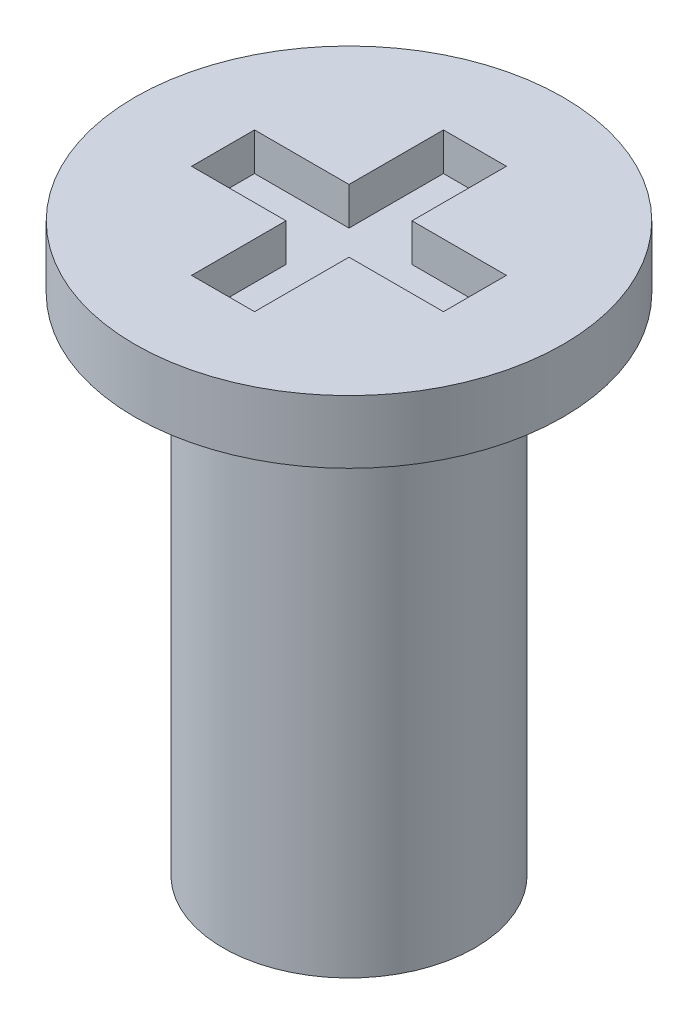
ISO-10303-21;
HEADER;
FILE_DESCRIPTION(('STEP AP214'),'2;1');
FILE_NAME('part.step','',(''),(''),'','','');
FILE_SCHEMA(('AUTOMOTIVE_DESIGN { 1 0 10303 214 1 1 1 1 }'));
ENDSEC;
DATA;
#1=APPLICATION_CONTEXT('core data for automotive mechanical design processes');
#2=APPLICATION_PROTOCOL_DEFINITION('international standard','automotive_design',2000,#1);
#3=PRODUCT_CONTEXT('',#1,'mechanical');
#4=PRODUCT('Part','Part','',(#3));
#5=PRODUCT_RELATED_PRODUCT_CATEGORY('part','',(#4));
#6=PRODUCT_DEFINITION_FORMATION('','',#4);
#7=PRODUCT_DEFINITION_CONTEXT('part definition',#1,'design');
#8=PRODUCT_DEFINITION('design','',#6,#7);
#9=PRODUCT_DEFINITION_SHAPE('','',#8);
#10=(LENGTH_UNIT() NAMED_UNIT(*) SI_UNIT(.MILLI.,.METRE.));
#11=(NAMED_UNIT(*) PLANE_ANGLE_UNIT() SI_UNIT($,.RADIAN.));
#12=(NAMED_UNIT(*) SI_UNIT($,.STERADIAN.) SOLID_ANGLE_UNIT());
#13=UNCERTAINTY_MEASURE_WITH_UNIT(LENGTH_MEASURE(1.E-05),#10,'distance_accuracy_value','');
#14=(GEOMETRIC_REPRESENTATION_CONTEXT(3) GLOBAL_UNCERTAINTY_ASSIGNED_CONTEXT((#13)) GLOBAL_UNIT_ASSIGNED_CONTEXT((#10,
#11,#12)) REPRESENTATION_CONTEXT('',''));
#15=CARTESIAN_POINT('',(0.,0.,0.));
#16=DIRECTION('',(0.,0.,1.));
#17=DIRECTION('',(1.,0.,0.));
#18=AXIS2_PLACEMENT_3D('',#15,#16,#17);
#19=CARTESIAN_POINT('',(0.,0.,0.));
#20=DIRECTION('',(0.,1.,0.));
#21=DIRECTION('',(-1.,0.,0.));
#22=AXIS2_PLACEMENT_3D('',#19,#20,#21);
#23=PLANE('',#22);
#24=DIRECTION('',(-1.,0.,0.));
#25=VECTOR('',#24,1.);
#26=CARTESIAN_POINT('',(0.,0.,-0.25));
#27=LINE('',#26,#25);
#28=CARTESIAN_POINT('',(1.,0.,-0.249999999999997));
#29=VERTEX_POINT('',#28);
#30=CARTESIAN_POINT('',(0.25,0.,-0.249999999999999));
#31=VERTEX_POINT('',#30);
#32=EDGE_CURVE('E196',#29,#31,#27,.T.);
#33=ORIENTED_EDGE('',*,*,#32,.F.);
#34=DIRECTION('',(0.,0.,-1.));
#35=VECTOR('',#34,1.);
#36=CARTESIAN_POINT('',(1.,0.,-0.249999999999997));
#37=LINE('',#36,#35);
#38=CARTESIAN_POINT('',(0.999999999999999,0.,0.250000000000003));
#39=VERTEX_POINT('',#38);
#40=EDGE_CURVE('E142',#39,#29,#37,.T.);
#41=ORIENTED_EDGE('',*,*,#40,.F.);
#42=DIRECTION('',(1.,0.,0.));
#43=VECTOR('',#42,1.);
#44=CARTESIAN_POINT('',(0.,0.,0.25));
#45=LINE('',#44,#43);
#46=CARTESIAN_POINT('',(0.25,0.,0.250000000000003));
#47=VERTEX_POINT('',#46);
#48=EDGE_CURVE('E198',#47,#39,#45,.T.);
#49=ORIENTED_EDGE('',*,*,#48,.F.);
#50=DIRECTION('',(0.,0.,-1.));
#51=VECTOR('',#50,1.);
#52=CARTESIAN_POINT('',(0.25,0.,0.));
#53=LINE('',#52,#51);
#54=CARTESIAN_POINT('',(0.25,0.,1.));
#55=VERTEX_POINT('',#54);
#56=EDGE_CURVE('E168',#55,#47,#53,.T.);
#57=ORIENTED_EDGE('',*,*,#56,.F.);
#58=DIRECTION('',(1.,0.,0.));
#59=VECTOR('',#58,1.);
#60=CARTESIAN_POINT('',(0.25,0.,1.));
#61=LINE('',#60,#59);
#62=CARTESIAN_POINT('',(-0.25,0.,1.));
#63=VERTEX_POINT('',#62);
#64=EDGE_CURVE('E172',#63,#55,#61,.T.);
#65=ORIENTED_EDGE('',*,*,#64,.F.);
#66=DIRECTION('',(0.,0.,1.));
#67=VECTOR('',#66,1.);
#68=CARTESIAN_POINT('',(-0.25,0.,0.));
#69=LINE('',#68,#67);
#70=CARTESIAN_POINT('',(-0.25,0.,0.249999999999998));
#71=VERTEX_POINT('',#70);
#72=EDGE_CURVE('E180',#71,#63,#69,.T.);
#73=ORIENTED_EDGE('',*,*,#72,.F.);
#74=DIRECTION('',(1.,0.,0.));
#75=VECTOR('',#74,1.);
#76=CARTESIAN_POINT('',(0.,0.,0.25));
#77=LINE('',#76,#75);
#78=CARTESIAN_POINT('',(-1.,0.,0.24999999999999));
#79=VERTEX_POINT('',#78);
#80=EDGE_CURVE('E161',#79,#71,#77,.T.);
#81=ORIENTED_EDGE('',*,*,#80,.F.);
#82=DIRECTION('',(0.,0.,1.));
#83=VECTOR('',#82,1.);
#84=CARTESIAN_POINT('',(-1.,0.,0.24999999999999));
#85=LINE('',#84,#83);
#86=CARTESIAN_POINT('',(-0.999999999999997,0.,-0.25000000000001));
#87=VERTEX_POINT('',#86);
#88=EDGE_CURVE('E158',#87,#79,#85,.T.);
#89=ORIENTED_EDGE('',*,*,#88,.F.);
#90=CARTESIAN_POINT('',(-0.25,0.,-0.250000000000001));
#91=VERTEX_POINT('',#90);
#92=EDGE_CURVE('E148',#91,#87,#27,.T.);
#93=ORIENTED_EDGE('',*,*,#92,.F.);
#94=DIRECTION('',(0.,0.,1.));
#95=VECTOR('',#94,1.);
#96=CARTESIAN_POINT('',(-0.25,0.,0.));
#97=LINE('',#96,#95);
#98=CARTESIAN_POINT('',(-0.25,0.,-1.));
#99=VERTEX_POINT('',#98);
#100=EDGE_CURVE('E210',#99,#91,#97,.T.);
#101=ORIENTED_EDGE('',*,*,#100,.F.);
#102=DIRECTION('',(-1.,0.,0.));
#103=VECTOR('',#102,1.);
#104=CARTESIAN_POINT('',(-0.25,0.,-1.));
#105=LINE('',#104,#103);
#106=CARTESIAN_POINT('',(0.25,0.,-1.));
#107=VERTEX_POINT('',#106);
#108=EDGE_CURVE('E213',#107,#99,#105,.T.);
#109=ORIENTED_EDGE('',*,*,#108,.F.);
#110=DIRECTION('',(0.,0.,-1.));
#111=VECTOR('',#110,1.);
#112=CARTESIAN_POINT('',(0.25,0.,0.));
#113=LINE('',#112,#111);
#114=EDGE_CURVE('E68',#31,#107,#113,.T.);
#115=ORIENTED_EDGE('',*,*,#114,.F.);
#116=EDGE_LOOP('',(#33,#41,#49,#57,#65,#73,#81,#89,#93,#101,#109,#115));
#117=FACE_BOUND('',#116,.T.);
#118=CARTESIAN_POINT('',(0.,0.,0.));
#119=DIRECTION('',(0.,-1.,0.));
#120=DIRECTION('',(1.,0.,0.));
#121=AXIS2_PLACEMENT_3D('',#118,#119,#120);
#122=CIRCLE('',#121,1.7);
#123=CARTESIAN_POINT('',(1.7,0.,0.));
#124=VERTEX_POINT('',#123);
#125=EDGE_CURVE('E11',#124,#124,#122,.T.);
#126=ORIENTED_EDGE('',*,*,#125,.F.);
#127=EDGE_LOOP('',(#126));
#128=FACE_BOUND('',#127,.T.);
#129=ADVANCED_FACE('F40',(#117,#128),#23,.T.);
#130=CARTESIAN_POINT('',(0.,-4.5,0.));
#131=DIRECTION('',(0.,-1.,0.));
#132=DIRECTION('',(1.,0.,0.));
#133=AXIS2_PLACEMENT_3D('',#130,#131,#132);
#134=CYLINDRICAL_SURFACE('',#133,1.7);
#135=ORIENTED_EDGE('',*,*,#125,.T.);
#136=EDGE_LOOP('',(#135));
#137=FACE_BOUND('',#136,.T.);
#138=CARTESIAN_POINT('',(0.,-0.5,0.));
#139=DIRECTION('',(0.,-1.,0.));
#140=DIRECTION('',(1.,0.,0.));
#141=AXIS2_PLACEMENT_3D('',#138,#139,#140);
#142=CIRCLE('',#141,1.7);
#143=CARTESIAN_POINT('',(1.7,-0.5,0.));
#144=VERTEX_POINT('',#143);
#145=EDGE_CURVE('E48',#144,#144,#142,.T.);
#146=ORIENTED_EDGE('',*,*,#145,.F.);
#147=EDGE_LOOP('',(#146));
#148=FACE_BOUND('',#147,.T.);
#149=ADVANCED_FACE('F235',(#137,#148),#134,.T.);
#150=CARTESIAN_POINT('',(1.7,-0.5,0.));
#151=DIRECTION('',(0.,-1.,0.));
#152=DIRECTION('',(1.,0.,0.));
#153=AXIS2_PLACEMENT_3D('',#150,#151,#152);
#154=PLANE('',#153);
#155=ORIENTED_EDGE('',*,*,#145,.T.);
#156=EDGE_LOOP('',(#155));
#157=FACE_BOUND('',#156,.T.);
#158=CARTESIAN_POINT('',(0.,-0.5,0.));
#159=DIRECTION('',(0.,-1.,0.));
#160=DIRECTION('',(1.,0.,0.));
#161=AXIS2_PLACEMENT_3D('',#158,#159,#160);
#162=CIRCLE('',#161,1.);
#163=CARTESIAN_POINT('',(1.,-0.5,0.));
#164=VERTEX_POINT('',#163);
#165=EDGE_CURVE('E227',#164,#164,#162,.T.);
#166=ORIENTED_EDGE('',*,*,#165,.F.);
#167=EDGE_LOOP('',(#166));
#168=FACE_BOUND('',#167,.T.);
#169=ADVANCED_FACE('F232',(#157,#168),#154,.T.);
#170=CARTESIAN_POINT('',(0.,-4.5,0.));
#171=DIRECTION('',(0.,-1.,0.));
#172=DIRECTION('',(1.,0.,0.));
#173=AXIS2_PLACEMENT_3D('',#170,#171,#172);
#174=CYLINDRICAL_SURFACE('',#173,1.);
#175=ORIENTED_EDGE('',*,*,#165,.T.);
#176=EDGE_LOOP('',(#175));
#177=FACE_BOUND('',#176,.T.);
#178=CARTESIAN_POINT('',(0.,-4.5,0.));
#179=DIRECTION('',(0.,-1.,0.));
#180=DIRECTION('',(1.,0.,0.));
#181=AXIS2_PLACEMENT_3D('',#178,#179,#180);
#182=CIRCLE('',#181,1.);
#183=CARTESIAN_POINT('',(1.,-4.5,0.));
#184=VERTEX_POINT('',#183);
#185=EDGE_CURVE('E223',#184,#184,#182,.T.);
#186=ORIENTED_EDGE('',*,*,#185,.F.);
#187=EDGE_LOOP('',(#186));
#188=FACE_BOUND('',#187,.T.);
#189=ADVANCED_FACE('F242',(#177,#188),#174,.T.);
#190=CARTESIAN_POINT('',(1.,-4.5,0.));
#191=DIRECTION('',(0.,-1.,0.));
#192=DIRECTION('',(1.,0.,0.));
#193=AXIS2_PLACEMENT_3D('',#190,#191,#192);
#194=PLANE('',#193);
#195=ORIENTED_EDGE('',*,*,#185,.T.);
#196=EDGE_LOOP('',(#195));
#197=FACE_BOUND('',#196,.T.);
#198=ADVANCED_FACE('F248',(#197),#194,.T.);
#199=CARTESIAN_POINT('',(-0.25,-0.3,0.));
#200=DIRECTION('',(-1.,0.,0.));
#201=DIRECTION('',(0.,-1.,0.));
#202=AXIS2_PLACEMENT_3D('',#199,#200,#201);
#203=PLANE('',#202);
#204=ORIENTED_EDGE('',*,*,#100,.T.);
#205=DIRECTION('',(0.,-1.,0.));
#206=VECTOR('',#205,1.);
#207=CARTESIAN_POINT('',(-0.25,-0.3,-0.250000000000001));
#208=LINE('',#207,#206);
#209=CARTESIAN_POINT('',(-0.25,-0.3,-0.250000000000001));
#210=VERTEX_POINT('',#209);
#211=EDGE_CURVE('E208',#91,#210,#208,.T.);
#212=ORIENTED_EDGE('',*,*,#211,.T.);
#213=DIRECTION('',(0.,0.,1.));
#214=VECTOR('',#213,1.);
#215=CARTESIAN_POINT('',(-0.25,-0.3,0.));
#216=LINE('',#215,#214);
#217=CARTESIAN_POINT('',(-0.25,-0.3,-1.));
#218=VERTEX_POINT('',#217);
#219=EDGE_CURVE('E140',#218,#210,#216,.T.);
#220=ORIENTED_EDGE('',*,*,#219,.F.);
#221=DIRECTION('',(0.,1.,0.));
#222=VECTOR('',#221,1.);
#223=CARTESIAN_POINT('',(-0.25,-0.3,-1.));
#224=LINE('',#223,#222);
#225=EDGE_CURVE('E56',#218,#99,#224,.T.);
#226=ORIENTED_EDGE('',*,*,#225,.T.);
#227=EDGE_LOOP('',(#204,#212,#220,#226));
#228=FACE_BOUND('',#227,.T.);
#229=ADVANCED_FACE('F252',(#228),#203,.F.);
#230=CARTESIAN_POINT('',(-0.25,-0.3,-1.));
#231=DIRECTION('',(0.,0.,-1.));
#232=DIRECTION('',(-1.,0.,0.));
#233=AXIS2_PLACEMENT_3D('',#230,#231,#232);
#234=PLANE('',#233);
#235=ORIENTED_EDGE('',*,*,#108,.T.);
#236=ORIENTED_EDGE('',*,*,#225,.F.);
#237=DIRECTION('',(-1.,0.,0.));
#238=VECTOR('',#237,1.);
#239=CARTESIAN_POINT('',(-0.25,-0.3,-1.));
#240=LINE('',#239,#238);
#241=CARTESIAN_POINT('',(0.25,-0.3,-1.));
#242=VERTEX_POINT('',#241);
#243=EDGE_CURVE('E215',#242,#218,#240,.T.);
#244=ORIENTED_EDGE('',*,*,#243,.F.);
#245=DIRECTION('',(0.,1.,0.));
#246=VECTOR('',#245,1.);
#247=CARTESIAN_POINT('',(0.25,-0.3,-1.));
#248=LINE('',#247,#246);
#249=EDGE_CURVE('E217',#242,#107,#248,.T.);
#250=ORIENTED_EDGE('',*,*,#249,.T.);
#251=EDGE_LOOP('',(#235,#236,#244,#250));
#252=FACE_BOUND('',#251,.T.);
#253=ADVANCED_FACE('F256',(#252),#234,.F.);
#254=CARTESIAN_POINT('',(0.25,-0.3,0.));
#255=DIRECTION('',(1.,0.,0.));
#256=DIRECTION('',(0.,1.,0.));
#257=AXIS2_PLACEMENT_3D('',#254,#255,#256);
#258=PLANE('',#257);
#259=DIRECTION('',(0.,0.,-1.));
#260=VECTOR('',#259,1.);
#261=CARTESIAN_POINT('',(0.25,-0.3,0.));
#262=LINE('',#261,#260);
#263=CARTESIAN_POINT('',(0.25,-0.3,-0.249999999999999));
#264=VERTEX_POINT('',#263);
#265=EDGE_CURVE('E212',#264,#242,#262,.T.);
#266=ORIENTED_EDGE('',*,*,#265,.F.);
#267=DIRECTION('',(0.,1.,0.));
#268=VECTOR('',#267,1.);
#269=CARTESIAN_POINT('',(0.25,-0.3,-0.249999999999999));
#270=LINE('',#269,#268);
#271=EDGE_CURVE('E204',#264,#31,#270,.T.);
#272=ORIENTED_EDGE('',*,*,#271,.T.);
#273=ORIENTED_EDGE('',*,*,#114,.T.);
#274=ORIENTED_EDGE('',*,*,#249,.F.);
#275=EDGE_LOOP('',(#266,#272,#273,#274));
#276=FACE_BOUND('',#275,.T.);
#277=ADVANCED_FACE('F258',(#276),#258,.F.);
#278=CARTESIAN_POINT('',(0.,-0.3,0.));
#279=DIRECTION('',(0.,-1.,0.));
#280=DIRECTION('',(1.,0.,0.));
#281=AXIS2_PLACEMENT_3D('',#278,#279,#280);
#282=PLANE('',#281);
#283=DIRECTION('',(-1.,0.,0.));
#284=VECTOR('',#283,1.);
#285=CARTESIAN_POINT('',(0.,-0.3,-0.25));
#286=LINE('',#285,#284);
#287=CARTESIAN_POINT('',(1.,-0.3,-0.249999999999997));
#288=VERTEX_POINT('',#287);
#289=EDGE_CURVE('E141',#288,#264,#286,.T.);
#290=ORIENTED_EDGE('',*,*,#289,.T.);
#291=ORIENTED_EDGE('',*,*,#265,.T.);
#292=ORIENTED_EDGE('',*,*,#243,.T.);
#293=ORIENTED_EDGE('',*,*,#219,.T.);
#294=CARTESIAN_POINT('',(-0.999999999999997,-0.3,-0.25000000000001));
#295=VERTEX_POINT('',#294);
#296=EDGE_CURVE('E76',#210,#295,#286,.T.);
#297=ORIENTED_EDGE('',*,*,#296,.T.);
#298=DIRECTION('',(0.,0.,1.));
#299=VECTOR('',#298,1.);
#300=CARTESIAN_POINT('',(-1.,-0.3,0.24999999999999));
#301=LINE('',#300,#299);
#302=CARTESIAN_POINT('',(-1.,-0.3,0.24999999999999));
#303=VERTEX_POINT('',#302);
#304=EDGE_CURVE('E138',#295,#303,#301,.T.);
#305=ORIENTED_EDGE('',*,*,#304,.T.);
#306=DIRECTION('',(1.,0.,0.));
#307=VECTOR('',#306,1.);
#308=CARTESIAN_POINT('',(0.,-0.3,0.25));
#309=LINE('',#308,#307);
#310=CARTESIAN_POINT('',(-0.25,-0.3,0.249999999999998));
#311=VERTEX_POINT('',#310);
#312=EDGE_CURVE('E156',#303,#311,#309,.T.);
#313=ORIENTED_EDGE('',*,*,#312,.T.);
#314=DIRECTION('',(0.,0.,1.));
#315=VECTOR('',#314,1.);
#316=CARTESIAN_POINT('',(-0.25,-0.3,0.));
#317=LINE('',#316,#315);
#318=CARTESIAN_POINT('',(-0.25,-0.3,1.));
#319=VERTEX_POINT('',#318);
#320=EDGE_CURVE('E171',#311,#319,#317,.T.);
#321=ORIENTED_EDGE('',*,*,#320,.T.);
#322=DIRECTION('',(1.,0.,0.));
#323=VECTOR('',#322,1.);
#324=CARTESIAN_POINT('',(0.25,-0.3,1.));
#325=LINE('',#324,#323);
#326=CARTESIAN_POINT('',(0.25,-0.3,1.));
#327=VERTEX_POINT('',#326);
#328=EDGE_CURVE('E174',#319,#327,#325,.T.);
#329=ORIENTED_EDGE('',*,*,#328,.T.);
#330=DIRECTION('',(0.,0.,-1.));
#331=VECTOR('',#330,1.);
#332=CARTESIAN_POINT('',(0.25,-0.3,0.));
#333=LINE('',#332,#331);
#334=CARTESIAN_POINT('',(0.25,-0.3,0.250000000000003));
#335=VERTEX_POINT('',#334);
#336=EDGE_CURVE('E169',#327,#335,#333,.T.);
#337=ORIENTED_EDGE('',*,*,#336,.T.);
#338=DIRECTION('',(1.,0.,0.));
#339=VECTOR('',#338,1.);
#340=CARTESIAN_POINT('',(0.,-0.3,0.25));
#341=LINE('',#340,#339);
#342=CARTESIAN_POINT('',(0.999999999999999,-0.3,0.250000000000003));
#343=VERTEX_POINT('',#342);
#344=EDGE_CURVE('E190',#335,#343,#341,.T.);
#345=ORIENTED_EDGE('',*,*,#344,.T.);
#346=DIRECTION('',(0.,0.,-1.));
#347=VECTOR('',#346,1.);
#348=CARTESIAN_POINT('',(1.,-0.3,-0.249999999999997));
#349=LINE('',#348,#347);
#350=EDGE_CURVE('E192',#343,#288,#349,.T.);
#351=ORIENTED_EDGE('',*,*,#350,.T.);
#352=EDGE_LOOP('',(#290,#291,#292,#293,#297,#305,#313,#321,#329,#337,#345,#351));
#353=FACE_BOUND('',#352,.T.);
#354=ADVANCED_FACE('F136',(#353),#282,.F.);
#355=CARTESIAN_POINT('',(0.,-0.3,-0.25));
#356=DIRECTION('',(0.,0.,-1.));
#357=DIRECTION('',(-1.,0.,0.));
#358=AXIS2_PLACEMENT_3D('',#355,#356,#357);
#359=PLANE('',#358);
#360=ORIENTED_EDGE('',*,*,#92,.T.);
#361=DIRECTION('',(0.,1.,0.));
#362=VECTOR('',#361,1.);
#363=CARTESIAN_POINT('',(-0.999999999999997,-0.3,-0.25000000000001));
#364=LINE('',#363,#362);
#365=EDGE_CURVE('E145',#295,#87,#364,.T.);
#366=ORIENTED_EDGE('',*,*,#365,.F.);
#367=ORIENTED_EDGE('',*,*,#296,.F.);
#368=ORIENTED_EDGE('',*,*,#211,.F.);
#369=EDGE_LOOP('',(#360,#366,#367,#368));
#370=FACE_BOUND('',#369,.T.);
#371=ADVANCED_FACE('F146',(#370),#359,.F.);
#372=ORIENTED_EDGE('',*,*,#289,.F.);
#373=DIRECTION('',(0.,1.,0.));
#374=VECTOR('',#373,1.);
#375=CARTESIAN_POINT('',(1.,-0.3,-0.249999999999997));
#376=LINE('',#375,#374);
#377=EDGE_CURVE('E202',#288,#29,#376,.T.);
#378=ORIENTED_EDGE('',*,*,#377,.T.);
#379=ORIENTED_EDGE('',*,*,#32,.T.);
#380=ORIENTED_EDGE('',*,*,#271,.F.);
#381=EDGE_LOOP('',(#372,#378,#379,#380));
#382=FACE_BOUND('',#381,.T.);
#383=ADVANCED_FACE('F267',(#382),#359,.F.);
#384=CARTESIAN_POINT('',(1.,-0.3,-0.249999999999997));
#385=DIRECTION('',(1.,0.,0.));
#386=DIRECTION('',(0.,0.,-1.));
#387=AXIS2_PLACEMENT_3D('',#384,#385,#386);
#388=PLANE('',#387);
#389=ORIENTED_EDGE('',*,*,#40,.T.);
#390=ORIENTED_EDGE('',*,*,#377,.F.);
#391=ORIENTED_EDGE('',*,*,#350,.F.);
#392=DIRECTION('',(0.,1.,0.));
#393=VECTOR('',#392,1.);
#394=CARTESIAN_POINT('',(0.999999999999999,-0.3,0.250000000000003));
#395=LINE('',#394,#393);
#396=EDGE_CURVE('E195',#343,#39,#395,.T.);
#397=ORIENTED_EDGE('',*,*,#396,.T.);
#398=EDGE_LOOP('',(#389,#390,#391,#397));
#399=FACE_BOUND('',#398,.T.);
#400=ADVANCED_FACE('F272',(#399),#388,.F.);
#401=CARTESIAN_POINT('',(0.,-0.3,0.25));
#402=DIRECTION('',(0.,0.,1.));
#403=DIRECTION('',(1.,0.,0.));
#404=AXIS2_PLACEMENT_3D('',#401,#402,#403);
#405=PLANE('',#404);
#406=DIRECTION('',(0.,1.,0.));
#407=VECTOR('',#406,1.);
#408=CARTESIAN_POINT('',(0.25,-0.3,0.250000000000001));
#409=LINE('',#408,#407);
#410=EDGE_CURVE('E186',#335,#47,#409,.T.);
#411=ORIENTED_EDGE('',*,*,#410,.T.);
#412=ORIENTED_EDGE('',*,*,#48,.T.);
#413=ORIENTED_EDGE('',*,*,#396,.F.);
#414=ORIENTED_EDGE('',*,*,#344,.F.);
#415=EDGE_LOOP('',(#411,#412,#413,#414));
#416=FACE_BOUND('',#415,.T.);
#417=ADVANCED_FACE('F268',(#416),#405,.F.);
#418=CARTESIAN_POINT('',(0.25,-0.3,0.));
#419=DIRECTION('',(1.,0.,0.));
#420=DIRECTION('',(0.,1.,0.));
#421=AXIS2_PLACEMENT_3D('',#418,#419,#420);
#422=PLANE('',#421);
#423=ORIENTED_EDGE('',*,*,#336,.F.);
#424=DIRECTION('',(0.,1.,0.));
#425=VECTOR('',#424,1.);
#426=CARTESIAN_POINT('',(0.25,-0.3,1.));
#427=LINE('',#426,#425);
#428=EDGE_CURVE('E184',#327,#55,#427,.T.);
#429=ORIENTED_EDGE('',*,*,#428,.T.);
#430=ORIENTED_EDGE('',*,*,#56,.T.);
#431=ORIENTED_EDGE('',*,*,#410,.F.);
#432=EDGE_LOOP('',(#423,#429,#430,#431));
#433=FACE_BOUND('',#432,.T.);
#434=ADVANCED_FACE('F271',(#433),#422,.F.);
#435=CARTESIAN_POINT('',(0.25,-0.3,1.));
#436=DIRECTION('',(0.,0.,1.));
#437=DIRECTION('',(1.,0.,0.));
#438=AXIS2_PLACEMENT_3D('',#435,#436,#437);
#439=PLANE('',#438);
#440=ORIENTED_EDGE('',*,*,#64,.T.);
#441=ORIENTED_EDGE('',*,*,#428,.F.);
#442=ORIENTED_EDGE('',*,*,#328,.F.);
#443=DIRECTION('',(0.,1.,0.));
#444=VECTOR('',#443,1.);
#445=CARTESIAN_POINT('',(-0.25,-0.3,1.));
#446=LINE('',#445,#444);
#447=EDGE_CURVE('E177',#319,#63,#446,.T.);
#448=ORIENTED_EDGE('',*,*,#447,.T.);
#449=EDGE_LOOP('',(#440,#441,#442,#448));
#450=FACE_BOUND('',#449,.T.);
#451=ADVANCED_FACE('F279',(#450),#439,.F.);
#452=CARTESIAN_POINT('',(-0.25,-0.3,0.));
#453=DIRECTION('',(-1.,0.,0.));
#454=DIRECTION('',(0.,-1.,0.));
#455=AXIS2_PLACEMENT_3D('',#452,#453,#454);
#456=PLANE('',#455);
#457=DIRECTION('',(0.,1.,0.));
#458=VECTOR('',#457,1.);
#459=CARTESIAN_POINT('',(-0.25,-0.3,0.249999999999998));
#460=LINE('',#459,#458);
#461=EDGE_CURVE('E165',#311,#71,#460,.T.);
#462=ORIENTED_EDGE('',*,*,#461,.T.);
#463=ORIENTED_EDGE('',*,*,#72,.T.);
#464=ORIENTED_EDGE('',*,*,#447,.F.);
#465=ORIENTED_EDGE('',*,*,#320,.F.);
#466=EDGE_LOOP('',(#462,#463,#464,#465));
#467=FACE_BOUND('',#466,.T.);
#468=ADVANCED_FACE('F281',(#467),#456,.F.);
#469=CARTESIAN_POINT('',(0.,-0.3,0.25));
#470=DIRECTION('',(0.,0.,1.));
#471=DIRECTION('',(1.,0.,0.));
#472=AXIS2_PLACEMENT_3D('',#469,#470,#471);
#473=PLANE('',#472);
#474=ORIENTED_EDGE('',*,*,#312,.F.);
#475=DIRECTION('',(0.,1.,0.));
#476=VECTOR('',#475,1.);
#477=CARTESIAN_POINT('',(-1.,-0.3,0.24999999999999));
#478=LINE('',#477,#476);
#479=EDGE_CURVE('E152',#303,#79,#478,.T.);
#480=ORIENTED_EDGE('',*,*,#479,.T.);
#481=ORIENTED_EDGE('',*,*,#80,.T.);
#482=ORIENTED_EDGE('',*,*,#461,.F.);
#483=EDGE_LOOP('',(#474,#480,#481,#482));
#484=FACE_BOUND('',#483,.T.);
#485=ADVANCED_FACE('F284',(#484),#473,.F.);
#486=CARTESIAN_POINT('',(-1.,-0.3,0.24999999999999));
#487=DIRECTION('',(-1.,0.,0.));
#488=DIRECTION('',(0.,0.,1.));
#489=AXIS2_PLACEMENT_3D('',#486,#487,#488);
#490=PLANE('',#489);
#491=ORIENTED_EDGE('',*,*,#88,.T.);
#492=ORIENTED_EDGE('',*,*,#479,.F.);
#493=ORIENTED_EDGE('',*,*,#304,.F.);
#494=ORIENTED_EDGE('',*,*,#365,.T.);
#495=EDGE_LOOP('',(#491,#492,#493,#494));
#496=FACE_BOUND('',#495,.T.);
#497=ADVANCED_FACE('F154',(#496),#490,.F.);
#498=CLOSED_SHELL('',(#129,#149,#169,#189,#198,#229,#253,#277,#354,#371,#383,#400,#417,#434,
#451,#468,#485,#497));
#499=MANIFOLD_SOLID_BREP('B2',#498);
#500=ADVANCED_BREP_SHAPE_REPRESENTATION('',(#18,#499),#14);
#501=SHAPE_DEFINITION_REPRESENTATION(#9,#500);
ENDSEC;
END-ISO-10303-21;
